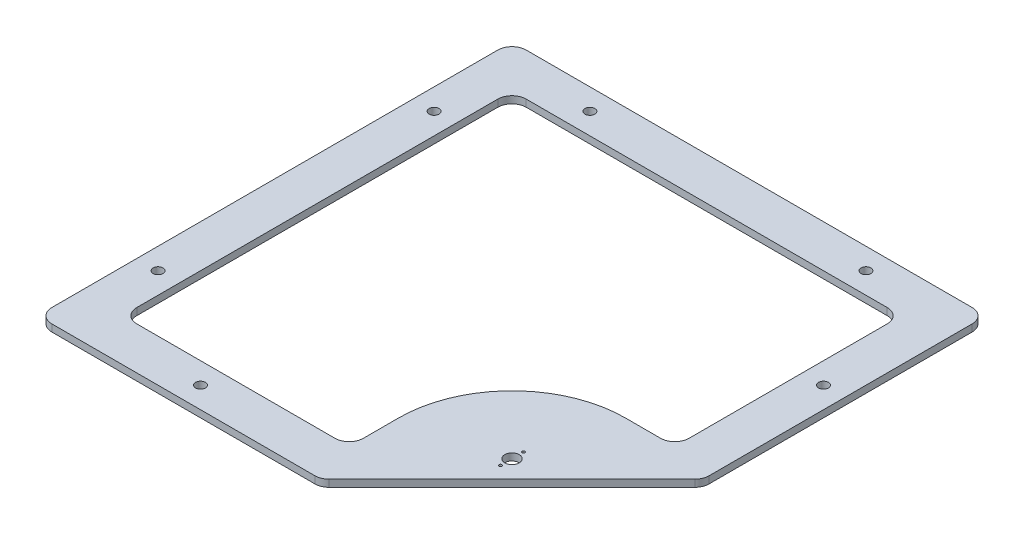
ISO-10303-21;
HEADER;
FILE_DESCRIPTION(('STEP AP214'),'2;1');
FILE_NAME('part.step','',(''),(''),'','','');
FILE_SCHEMA(('AUTOMOTIVE_DESIGN { 1 0 10303 214 1 1 1 1 }'));
ENDSEC;
DATA;
#1=APPLICATION_CONTEXT('core data for automotive mechanical design processes');
#2=APPLICATION_PROTOCOL_DEFINITION('international standard','automotive_design',2000,#1);
#3=PRODUCT_CONTEXT('',#1,'mechanical');
#4=PRODUCT('Part','Part','',(#3));
#5=PRODUCT_RELATED_PRODUCT_CATEGORY('part','',(#4));
#6=PRODUCT_DEFINITION_FORMATION('','',#4);
#7=PRODUCT_DEFINITION_CONTEXT('part definition',#1,'design');
#8=PRODUCT_DEFINITION('design','',#6,#7);
#9=PRODUCT_DEFINITION_SHAPE('','',#8);
#10=(LENGTH_UNIT() NAMED_UNIT(*) SI_UNIT(.MILLI.,.METRE.));
#11=(NAMED_UNIT(*) PLANE_ANGLE_UNIT() SI_UNIT($,.RADIAN.));
#12=(NAMED_UNIT(*) SI_UNIT($,.STERADIAN.) SOLID_ANGLE_UNIT());
#13=UNCERTAINTY_MEASURE_WITH_UNIT(LENGTH_MEASURE(1.E-05),#10,'distance_accuracy_value','');
#14=(GEOMETRIC_REPRESENTATION_CONTEXT(3) GLOBAL_UNCERTAINTY_ASSIGNED_CONTEXT((#13)) GLOBAL_UNIT_ASSIGNED_CONTEXT((#10,
#11,#12)) REPRESENTATION_CONTEXT('',''));
#15=CARTESIAN_POINT('',(0.,0.,0.));
#16=DIRECTION('',(0.,0.,1.));
#17=DIRECTION('',(1.,0.,0.));
#18=AXIS2_PLACEMENT_3D('',#15,#16,#17);
#19=CARTESIAN_POINT('',(212.725,3.175,212.725));
#20=DIRECTION('',(-1.,0.,0.));
#21=DIRECTION('',(0.,0.,1.));
#22=AXIS2_PLACEMENT_3D('',#19,#20,#21);
#23=PLANE('',#22);
#24=DIRECTION('',(0.,0.,-1.));
#25=VECTOR('',#24,1.);
#26=CARTESIAN_POINT('',(212.725,3.175,212.725));
#27=LINE('',#26,#25);
#28=CARTESIAN_POINT('',(212.725,3.175,36.0144877578617));
#29=VERTEX_POINT('',#28);
#30=CARTESIAN_POINT('',(212.725,3.175,-200.025));
#31=VERTEX_POINT('',#30);
#32=EDGE_CURVE('E217',#29,#31,#27,.T.);
#33=ORIENTED_EDGE('',*,*,#32,.F.);
#34=DIRECTION('',(0.,1.,0.));
#35=VECTOR('',#34,1.);
#36=CARTESIAN_POINT('',(212.725,3.175,36.0144877578617));
#37=LINE('',#36,#35);
#38=CARTESIAN_POINT('',(212.725,-3.175,36.0144877578617));
#39=VERTEX_POINT('',#38);
#40=EDGE_CURVE('E187',#29,#39,#37,.F.);
#41=ORIENTED_EDGE('',*,*,#40,.T.);
#42=DIRECTION('',(0.,0.,-1.));
#43=VECTOR('',#42,1.);
#44=CARTESIAN_POINT('',(212.725,-3.175,212.725));
#45=LINE('',#44,#43);
#46=CARTESIAN_POINT('',(212.725,-3.175,-200.025));
#47=VERTEX_POINT('',#46);
#48=EDGE_CURVE('E210',#39,#47,#45,.T.);
#49=ORIENTED_EDGE('',*,*,#48,.T.);
#50=DIRECTION('',(0.,-1.,0.));
#51=VECTOR('',#50,1.);
#52=CARTESIAN_POINT('',(212.725,3.175,-200.025));
#53=LINE('',#52,#51);
#54=EDGE_CURVE('E192',#47,#31,#53,.F.);
#55=ORIENTED_EDGE('',*,*,#54,.T.);
#56=EDGE_LOOP('',(#33,#41,#49,#55));
#57=FACE_BOUND('',#56,.T.);
#58=ADVANCED_FACE('F33',(#57),#23,.F.);
#59=CARTESIAN_POINT('',(-212.725,3.175,-212.725));
#60=DIRECTION('',(0.,0.,1.));
#61=DIRECTION('',(1.,0.,0.));
#62=AXIS2_PLACEMENT_3D('',#59,#60,#61);
#63=PLANE('',#62);
#64=DIRECTION('',(-1.,0.,0.));
#65=VECTOR('',#64,1.);
#66=CARTESIAN_POINT('',(-212.725,-3.175,-212.725));
#67=LINE('',#66,#65);
#68=CARTESIAN_POINT('',(200.025,-3.175,-212.725));
#69=VERTEX_POINT('',#68);
#70=CARTESIAN_POINT('',(-200.025,-3.175,-212.725));
#71=VERTEX_POINT('',#70);
#72=EDGE_CURVE('E230',#69,#71,#67,.T.);
#73=ORIENTED_EDGE('',*,*,#72,.T.);
#74=DIRECTION('',(0.,-1.,0.));
#75=VECTOR('',#74,1.);
#76=CARTESIAN_POINT('',(-200.025,3.175,-212.725));
#77=LINE('',#76,#75);
#78=CARTESIAN_POINT('',(-200.025,3.175,-212.725));
#79=VERTEX_POINT('',#78);
#80=EDGE_CURVE('E281',#71,#79,#77,.F.);
#81=ORIENTED_EDGE('',*,*,#80,.T.);
#82=DIRECTION('',(-1.,0.,0.));
#83=VECTOR('',#82,1.);
#84=CARTESIAN_POINT('',(-212.725,3.175,-212.725));
#85=LINE('',#84,#83);
#86=CARTESIAN_POINT('',(200.025,3.175,-212.725));
#87=VERTEX_POINT('',#86);
#88=EDGE_CURVE('E219',#87,#79,#85,.T.);
#89=ORIENTED_EDGE('',*,*,#88,.F.);
#90=DIRECTION('',(0.,-1.,0.));
#91=VECTOR('',#90,1.);
#92=CARTESIAN_POINT('',(200.025,3.175,-212.725));
#93=LINE('',#92,#91);
#94=EDGE_CURVE('E278',#87,#69,#93,.T.);
#95=ORIENTED_EDGE('',*,*,#94,.T.);
#96=EDGE_LOOP('',(#73,#81,#89,#95));
#97=FACE_BOUND('',#96,.T.);
#98=ADVANCED_FACE('F412',(#97),#63,.F.);
#99=CARTESIAN_POINT('',(-212.725,3.175,212.725));
#100=DIRECTION('',(1.,0.,0.));
#101=DIRECTION('',(0.,0.,-1.));
#102=AXIS2_PLACEMENT_3D('',#99,#100,#101);
#103=PLANE('',#102);
#104=DIRECTION('',(0.,0.,1.));
#105=VECTOR('',#104,1.);
#106=CARTESIAN_POINT('',(-212.725,3.175,212.725));
#107=LINE('',#106,#105);
#108=CARTESIAN_POINT('',(-212.725,3.175,-200.025));
#109=VERTEX_POINT('',#108);
#110=CARTESIAN_POINT('',(-212.725,3.175,200.025));
#111=VERTEX_POINT('',#110);
#112=EDGE_CURVE('E223',#109,#111,#107,.T.);
#113=ORIENTED_EDGE('',*,*,#112,.F.);
#114=DIRECTION('',(0.,-1.,0.));
#115=VECTOR('',#114,1.);
#116=CARTESIAN_POINT('',(-212.725,3.175,-200.025));
#117=LINE('',#116,#115);
#118=CARTESIAN_POINT('',(-212.725,-3.175,-200.025));
#119=VERTEX_POINT('',#118);
#120=EDGE_CURVE('E275',#109,#119,#117,.T.);
#121=ORIENTED_EDGE('',*,*,#120,.T.);
#122=DIRECTION('',(0.,0.,1.));
#123=VECTOR('',#122,1.);
#124=CARTESIAN_POINT('',(-212.725,-3.175,212.725));
#125=LINE('',#124,#123);
#126=CARTESIAN_POINT('',(-212.725,-3.175,200.025));
#127=VERTEX_POINT('',#126);
#128=EDGE_CURVE('E233',#119,#127,#125,.T.);
#129=ORIENTED_EDGE('',*,*,#128,.T.);
#130=DIRECTION('',(0.,-1.,0.));
#131=VECTOR('',#130,1.);
#132=CARTESIAN_POINT('',(-212.725,3.175,200.025));
#133=LINE('',#132,#131);
#134=EDGE_CURVE('E273',#127,#111,#133,.F.);
#135=ORIENTED_EDGE('',*,*,#134,.T.);
#136=EDGE_LOOP('',(#113,#121,#129,#135));
#137=FACE_BOUND('',#136,.T.);
#138=ADVANCED_FACE('F407',(#137),#103,.F.);
#139=CARTESIAN_POINT('',(-212.725,3.175,212.725));
#140=DIRECTION('',(0.,0.,-1.));
#141=DIRECTION('',(-1.,0.,0.));
#142=AXIS2_PLACEMENT_3D('',#139,#140,#141);
#143=PLANE('',#142);
#144=DIRECTION('',(1.,0.,0.));
#145=VECTOR('',#144,1.);
#146=CARTESIAN_POINT('',(-212.725,-3.175,212.725));
#147=LINE('',#146,#145);
#148=CARTESIAN_POINT('',(-200.025,-3.175,212.725));
#149=VERTEX_POINT('',#148);
#150=CARTESIAN_POINT('',(36.0144877578617,-3.175,212.725));
#151=VERTEX_POINT('',#150);
#152=EDGE_CURVE('E220',#149,#151,#147,.T.);
#153=ORIENTED_EDGE('',*,*,#152,.T.);
#154=DIRECTION('',(0.,1.,0.));
#155=VECTOR('',#154,1.);
#156=CARTESIAN_POINT('',(36.0144877578617,3.175,212.725));
#157=LINE('',#156,#155);
#158=CARTESIAN_POINT('',(36.0144877578617,3.175,212.725));
#159=VERTEX_POINT('',#158);
#160=EDGE_CURVE('E260',#151,#159,#157,.T.);
#161=ORIENTED_EDGE('',*,*,#160,.T.);
#162=DIRECTION('',(1.,0.,0.));
#163=VECTOR('',#162,1.);
#164=CARTESIAN_POINT('',(-212.725,3.175,212.725));
#165=LINE('',#164,#163);
#166=CARTESIAN_POINT('',(-200.025,3.175,212.725));
#167=VERTEX_POINT('',#166);
#168=EDGE_CURVE('E226',#167,#159,#165,.T.);
#169=ORIENTED_EDGE('',*,*,#168,.F.);
#170=DIRECTION('',(0.,-1.,0.));
#171=VECTOR('',#170,1.);
#172=CARTESIAN_POINT('',(-200.025,3.175,212.725));
#173=LINE('',#172,#171);
#174=EDGE_CURVE('E257',#167,#149,#173,.T.);
#175=ORIENTED_EDGE('',*,*,#174,.T.);
#176=EDGE_LOOP('',(#153,#161,#169,#175));
#177=FACE_BOUND('',#176,.T.);
#178=ADVANCED_FACE('F399',(#177),#143,.F.);
#179=CARTESIAN_POINT('',(0.,3.175,0.));
#180=DIRECTION('',(0.,-1.,0.));
#181=DIRECTION('',(0.,0.,-1.));
#182=AXIS2_PLACEMENT_3D('',#179,#180,#181);
#183=PLANE('',#182);
#184=DIRECTION('',(1.,0.,0.));
#185=VECTOR('',#184,1.);
#186=CARTESIAN_POINT('',(174.625,3.175,28.5749999999999));
#187=LINE('',#186,#185);
#188=CARTESIAN_POINT('',(130.175,3.175,28.5749999999999));
#189=VERTEX_POINT('',#188);
#190=CARTESIAN_POINT('',(161.925,3.175,28.5749999999999));
#191=VERTEX_POINT('',#190);
#192=EDGE_CURVE('E327',#189,#191,#187,.T.);
#193=ORIENTED_EDGE('',*,*,#192,.F.);
#194=CARTESIAN_POINT('',(130.175,3.175,130.175));
#195=DIRECTION('',(0.,-1.,0.));
#196=DIRECTION('',(0.,0.,-1.));
#197=AXIS2_PLACEMENT_3D('',#194,#195,#196);
#198=CIRCLE('',#197,101.6);
#199=CARTESIAN_POINT('',(28.5749999999999,3.175,130.175));
#200=VERTEX_POINT('',#199);
#201=EDGE_CURVE('E55',#189,#200,#198,.F.);
#202=ORIENTED_EDGE('',*,*,#201,.T.);
#203=DIRECTION('',(0.,0.,-1.));
#204=VECTOR('',#203,1.);
#205=CARTESIAN_POINT('',(28.5749999999999,3.175,28.5749999999999));
#206=LINE('',#205,#204);
#207=CARTESIAN_POINT('',(28.5749999999999,3.175,161.925));
#208=VERTEX_POINT('',#207);
#209=EDGE_CURVE('E335',#208,#200,#206,.T.);
#210=ORIENTED_EDGE('',*,*,#209,.F.);
#211=CARTESIAN_POINT('',(15.8749999999999,3.175,161.925));
#212=DIRECTION('',(0.,-1.,0.));
#213=DIRECTION('',(0.,0.,-1.));
#214=AXIS2_PLACEMENT_3D('',#211,#212,#213);
#215=CIRCLE('',#214,12.7);
#216=CARTESIAN_POINT('',(15.8749999999999,3.175,174.625));
#217=VERTEX_POINT('',#216);
#218=EDGE_CURVE('E312',#208,#217,#215,.T.);
#219=ORIENTED_EDGE('',*,*,#218,.T.);
#220=DIRECTION('',(1.,0.,0.));
#221=VECTOR('',#220,1.);
#222=CARTESIAN_POINT('',(28.5749999999999,3.175,174.625));
#223=LINE('',#222,#221);
#224=CARTESIAN_POINT('',(-161.925,3.175,174.625));
#225=VERTEX_POINT('',#224);
#226=EDGE_CURVE('E340',#225,#217,#223,.T.);
#227=ORIENTED_EDGE('',*,*,#226,.F.);
#228=CARTESIAN_POINT('',(-161.925,3.175,161.925));
#229=DIRECTION('',(0.,-1.,0.));
#230=DIRECTION('',(0.,0.,-1.));
#231=AXIS2_PLACEMENT_3D('',#228,#229,#230);
#232=CIRCLE('',#231,12.7);
#233=CARTESIAN_POINT('',(-174.625,3.175,161.925));
#234=VERTEX_POINT('',#233);
#235=EDGE_CURVE('E316',#225,#234,#232,.T.);
#236=ORIENTED_EDGE('',*,*,#235,.T.);
#237=DIRECTION('',(0.,0.,1.));
#238=VECTOR('',#237,1.);
#239=CARTESIAN_POINT('',(-174.625,3.175,174.625));
#240=LINE('',#239,#238);
#241=CARTESIAN_POINT('',(-174.625,3.175,-161.925));
#242=VERTEX_POINT('',#241);
#243=EDGE_CURVE('E788',#242,#234,#240,.T.);
#244=ORIENTED_EDGE('',*,*,#243,.F.);
#245=CARTESIAN_POINT('',(-161.925,3.175,-161.925));
#246=DIRECTION('',(0.,-1.,0.));
#247=DIRECTION('',(0.,0.,-1.));
#248=AXIS2_PLACEMENT_3D('',#245,#246,#247);
#249=CIRCLE('',#248,12.7);
#250=CARTESIAN_POINT('',(-161.925,3.175,-174.625));
#251=VERTEX_POINT('',#250);
#252=EDGE_CURVE('E299',#242,#251,#249,.T.);
#253=ORIENTED_EDGE('',*,*,#252,.T.);
#254=DIRECTION('',(-1.,0.,0.));
#255=VECTOR('',#254,1.);
#256=CARTESIAN_POINT('',(-174.625,3.175,-174.625));
#257=LINE('',#256,#255);
#258=CARTESIAN_POINT('',(161.925,3.175,-174.625));
#259=VERTEX_POINT('',#258);
#260=EDGE_CURVE('E785',#259,#251,#257,.T.);
#261=ORIENTED_EDGE('',*,*,#260,.F.);
#262=CARTESIAN_POINT('',(161.925,3.175,-161.925));
#263=DIRECTION('',(0.,-1.,0.));
#264=DIRECTION('',(0.,0.,-1.));
#265=AXIS2_PLACEMENT_3D('',#262,#263,#264);
#266=CIRCLE('',#265,12.7);
#267=CARTESIAN_POINT('',(174.625,3.175,-161.925));
#268=VERTEX_POINT('',#267);
#269=EDGE_CURVE('E303',#259,#268,#266,.T.);
#270=ORIENTED_EDGE('',*,*,#269,.T.);
#271=DIRECTION('',(0.,0.,-1.));
#272=VECTOR('',#271,1.);
#273=CARTESIAN_POINT('',(174.625,3.175,-174.625));
#274=LINE('',#273,#272);
#275=CARTESIAN_POINT('',(174.625,3.175,15.8749999999999));
#276=VERTEX_POINT('',#275);
#277=EDGE_CURVE('E334',#276,#268,#274,.T.);
#278=ORIENTED_EDGE('',*,*,#277,.F.);
#279=CARTESIAN_POINT('',(161.925,3.175,15.8749999999999));
#280=DIRECTION('',(0.,-1.,0.));
#281=DIRECTION('',(0.,0.,-1.));
#282=AXIS2_PLACEMENT_3D('',#279,#280,#281);
#283=CIRCLE('',#282,12.7);
#284=EDGE_CURVE('E307',#276,#191,#283,.T.);
#285=ORIENTED_EDGE('',*,*,#284,.T.);
#286=EDGE_LOOP('',(#193,#202,#210,#219,#227,#236,#244,#253,#261,#270,#278,#285));
#287=FACE_BOUND('',#286,.T.);
#288=CARTESIAN_POINT('',(-85.7250000000001,3.175,193.675));
#289=DIRECTION('',(0.,1.,0.));
#290=DIRECTION('',(0.,0.,1.));
#291=AXIS2_PLACEMENT_3D('',#288,#289,#290);
#292=CIRCLE('',#291,4.4196);
#293=CARTESIAN_POINT('',(-85.7250000000001,3.175,198.0946));
#294=VERTEX_POINT('',#293);
#295=EDGE_CURVE('E344',#294,#294,#292,.T.);
#296=ORIENTED_EDGE('',*,*,#295,.F.);
#297=EDGE_LOOP('',(#296));
#298=FACE_BOUND('',#297,.T.);
#299=CARTESIAN_POINT('',(-193.675,3.175,123.825));
#300=DIRECTION('',(0.,1.,0.));
#301=DIRECTION('',(0.,0.,1.));
#302=AXIS2_PLACEMENT_3D('',#299,#300,#301);
#303=CIRCLE('',#302,4.4196);
#304=CARTESIAN_POINT('',(-193.675,3.175,128.2446));
#305=VERTEX_POINT('',#304);
#306=EDGE_CURVE('E351',#305,#305,#303,.T.);
#307=ORIENTED_EDGE('',*,*,#306,.F.);
#308=EDGE_LOOP('',(#307));
#309=FACE_BOUND('',#308,.T.);
#310=CARTESIAN_POINT('',(-193.675,3.175,-123.825));
#311=DIRECTION('',(0.,1.,0.));
#312=DIRECTION('',(0.,0.,1.));
#313=AXIS2_PLACEMENT_3D('',#310,#311,#312);
#314=CIRCLE('',#313,4.4196);
#315=CARTESIAN_POINT('',(-193.675,3.175,-119.4054));
#316=VERTEX_POINT('',#315);
#317=EDGE_CURVE('E357',#316,#316,#314,.T.);
#318=ORIENTED_EDGE('',*,*,#317,.F.);
#319=EDGE_LOOP('',(#318));
#320=FACE_BOUND('',#319,.T.);
#321=CARTESIAN_POINT('',(-123.825,3.175,-193.675));
#322=DIRECTION('',(0.,1.,0.));
#323=DIRECTION('',(0.,0.,1.));
#324=AXIS2_PLACEMENT_3D('',#321,#322,#323);
#325=CIRCLE('',#324,4.4196);
#326=CARTESIAN_POINT('',(-123.825,3.175,-189.2554));
#327=VERTEX_POINT('',#326);
#328=EDGE_CURVE('E363',#327,#327,#325,.T.);
#329=ORIENTED_EDGE('',*,*,#328,.F.);
#330=EDGE_LOOP('',(#329));
#331=FACE_BOUND('',#330,.T.);
#332=CARTESIAN_POINT('',(123.825,3.175,-193.675));
#333=DIRECTION('',(0.,1.,0.));
#334=DIRECTION('',(0.,0.,1.));
#335=AXIS2_PLACEMENT_3D('',#332,#333,#334);
#336=CIRCLE('',#335,4.41960000000001);
#337=CARTESIAN_POINT('',(123.825,3.175,-189.2554));
#338=VERTEX_POINT('',#337);
#339=EDGE_CURVE('E369',#338,#338,#336,.T.);
#340=ORIENTED_EDGE('',*,*,#339,.F.);
#341=EDGE_LOOP('',(#340));
#342=FACE_BOUND('',#341,.T.);
#343=CARTESIAN_POINT('',(193.675,3.175,-85.725));
#344=DIRECTION('',(0.,1.,0.));
#345=DIRECTION('',(0.,0.,1.));
#346=AXIS2_PLACEMENT_3D('',#343,#344,#345);
#347=CIRCLE('',#346,4.4196);
#348=CARTESIAN_POINT('',(193.675,3.175,-81.3054));
#349=VERTEX_POINT('',#348);
#350=EDGE_CURVE('E375',#349,#349,#347,.T.);
#351=ORIENTED_EDGE('',*,*,#350,.F.);
#352=EDGE_LOOP('',(#351));
#353=FACE_BOUND('',#352,.T.);
#354=CARTESIAN_POINT('',(111.125,3.175,100.7999));
#355=DIRECTION('',(0.,1.,0.));
#356=DIRECTION('',(0.,0.,1.));
#357=AXIS2_PLACEMENT_3D('',#354,#355,#356);
#358=CIRCLE('',#357,1.26999999999999);
#359=CARTESIAN_POINT('',(111.125,3.175,102.0699));
#360=VERTEX_POINT('',#359);
#361=EDGE_CURVE('E385',#360,#360,#358,.T.);
#362=ORIENTED_EDGE('',*,*,#361,.F.);
#363=EDGE_LOOP('',(#362));
#364=FACE_BOUND('',#363,.T.);
#365=CARTESIAN_POINT('',(111.125,3.175,121.4501));
#366=DIRECTION('',(0.,1.,0.));
#367=DIRECTION('',(0.,0.,1.));
#368=AXIS2_PLACEMENT_3D('',#365,#366,#367);
#369=CIRCLE('',#368,1.26999999999999);
#370=CARTESIAN_POINT('',(111.125,3.175,122.7201));
#371=VERTEX_POINT('',#370);
#372=EDGE_CURVE('E381',#371,#371,#369,.T.);
#373=ORIENTED_EDGE('',*,*,#372,.F.);
#374=EDGE_LOOP('',(#373));
#375=FACE_BOUND('',#374,.T.);
#376=CARTESIAN_POINT('',(111.125,3.175,111.125));
#377=DIRECTION('',(0.,1.,0.));
#378=DIRECTION('',(0.,0.,1.));
#379=AXIS2_PLACEMENT_3D('',#376,#377,#378);
#380=CIRCLE('',#379,6.477);
#381=CARTESIAN_POINT('',(111.125,3.175,117.602));
#382=VERTEX_POINT('',#381);
#383=EDGE_CURVE('E213',#382,#382,#380,.T.);
#384=ORIENTED_EDGE('',*,*,#383,.F.);
#385=EDGE_LOOP('',(#384));
#386=FACE_BOUND('',#385,.T.);
#387=DIRECTION('',(-0.707106781186548,0.,0.707106781186548));
#388=VECTOR('',#387,1.);
#389=CARTESIAN_POINT('',(212.725,3.175,41.275));
#390=LINE('',#389,#388);
#391=CARTESIAN_POINT('',(209.005256121069,3.175,44.9947438789308));
#392=VERTEX_POINT('',#391);
#393=CARTESIAN_POINT('',(44.9947438789308,3.175,209.005256121069));
#394=VERTEX_POINT('',#393);
#395=EDGE_CURVE('E199',#392,#394,#390,.T.);
#396=ORIENTED_EDGE('',*,*,#395,.F.);
#397=CARTESIAN_POINT('',(200.025,3.175,36.0144877578617));
#398=DIRECTION('',(0.,-1.,0.));
#399=DIRECTION('',(0.,0.,-1.));
#400=AXIS2_PLACEMENT_3D('',#397,#398,#399);
#401=CIRCLE('',#400,12.7);
#402=EDGE_CURVE('E182',#392,#29,#401,.F.);
#403=ORIENTED_EDGE('',*,*,#402,.T.);
#404=ORIENTED_EDGE('',*,*,#32,.T.);
#405=CARTESIAN_POINT('',(200.025,3.175,-200.025));
#406=DIRECTION('',(0.,-1.,0.));
#407=DIRECTION('',(0.,0.,-1.));
#408=AXIS2_PLACEMENT_3D('',#405,#406,#407);
#409=CIRCLE('',#408,12.7);
#410=EDGE_CURVE('E240',#31,#87,#409,.F.);
#411=ORIENTED_EDGE('',*,*,#410,.T.);
#412=ORIENTED_EDGE('',*,*,#88,.T.);
#413=CARTESIAN_POINT('',(-200.025,3.175,-200.025));
#414=DIRECTION('',(0.,-1.,0.));
#415=DIRECTION('',(0.,0.,-1.));
#416=AXIS2_PLACEMENT_3D('',#413,#414,#415);
#417=CIRCLE('',#416,12.7);
#418=EDGE_CURVE('E242',#79,#109,#417,.F.);
#419=ORIENTED_EDGE('',*,*,#418,.T.);
#420=ORIENTED_EDGE('',*,*,#112,.T.);
#421=CARTESIAN_POINT('',(-200.025,3.175,200.025));
#422=DIRECTION('',(0.,-1.,0.));
#423=DIRECTION('',(0.,0.,-1.));
#424=AXIS2_PLACEMENT_3D('',#421,#422,#423);
#425=CIRCLE('',#424,12.7);
#426=EDGE_CURVE('E203',#111,#167,#425,.F.);
#427=ORIENTED_EDGE('',*,*,#426,.T.);
#428=ORIENTED_EDGE('',*,*,#168,.T.);
#429=CARTESIAN_POINT('',(36.0144877578617,3.175,200.025));
#430=DIRECTION('',(0.,-1.,0.));
#431=DIRECTION('',(0.,0.,-1.));
#432=AXIS2_PLACEMENT_3D('',#429,#430,#431);
#433=CIRCLE('',#432,12.7);
#434=EDGE_CURVE('E193',#159,#394,#433,.F.);
#435=ORIENTED_EDGE('',*,*,#434,.T.);
#436=EDGE_LOOP('',(#396,#403,#404,#411,#412,#419,#420,#427,#428,#435));
#437=FACE_BOUND('',#436,.T.);
#438=ADVANCED_FACE('F206',(#287,#298,#309,#320,#331,#342,#353,#364,#375,#386,#437),#183,.F.);
#439=CARTESIAN_POINT('',(0.,-3.175,0.));
#440=DIRECTION('',(0.,-1.,0.));
#441=DIRECTION('',(0.,0.,-1.));
#442=AXIS2_PLACEMENT_3D('',#439,#440,#441);
#443=PLANE('',#442);
#444=DIRECTION('',(0.,0.,-1.));
#445=VECTOR('',#444,1.);
#446=CARTESIAN_POINT('',(28.5749999999999,-3.175,28.5749999999999));
#447=LINE('',#446,#445);
#448=CARTESIAN_POINT('',(28.5749999999999,-3.175,161.925));
#449=VERTEX_POINT('',#448);
#450=CARTESIAN_POINT('',(28.5749999999999,-3.175,130.175));
#451=VERTEX_POINT('',#450);
#452=EDGE_CURVE('E773',#449,#451,#447,.T.);
#453=ORIENTED_EDGE('',*,*,#452,.T.);
#454=CARTESIAN_POINT('',(130.175,-3.175,130.175));
#455=DIRECTION('',(0.,-1.,0.));
#456=DIRECTION('',(0.,0.,-1.));
#457=AXIS2_PLACEMENT_3D('',#454,#455,#456);
#458=CIRCLE('',#457,101.6);
#459=CARTESIAN_POINT('',(130.175,-3.175,28.5749999999999));
#460=VERTEX_POINT('',#459);
#461=EDGE_CURVE('E11',#451,#460,#458,.T.);
#462=ORIENTED_EDGE('',*,*,#461,.T.);
#463=DIRECTION('',(1.,0.,0.));
#464=VECTOR('',#463,1.);
#465=CARTESIAN_POINT('',(174.625,-3.175,28.5749999999999));
#466=LINE('',#465,#464);
#467=CARTESIAN_POINT('',(161.925,-3.175,28.5749999999999));
#468=VERTEX_POINT('',#467);
#469=EDGE_CURVE('E328',#460,#468,#466,.T.);
#470=ORIENTED_EDGE('',*,*,#469,.T.);
#471=CARTESIAN_POINT('',(161.925,-3.175,15.8749999999999));
#472=DIRECTION('',(0.,-1.,0.));
#473=DIRECTION('',(0.,0.,-1.));
#474=AXIS2_PLACEMENT_3D('',#471,#472,#473);
#475=CIRCLE('',#474,12.7);
#476=CARTESIAN_POINT('',(174.625,-3.175,15.8749999999999));
#477=VERTEX_POINT('',#476);
#478=EDGE_CURVE('E310',#468,#477,#475,.F.);
#479=ORIENTED_EDGE('',*,*,#478,.T.);
#480=DIRECTION('',(0.,0.,-1.));
#481=VECTOR('',#480,1.);
#482=CARTESIAN_POINT('',(174.625,-3.175,-174.625));
#483=LINE('',#482,#481);
#484=CARTESIAN_POINT('',(174.625,-3.175,-161.925));
#485=VERTEX_POINT('',#484);
#486=EDGE_CURVE('E348',#477,#485,#483,.T.);
#487=ORIENTED_EDGE('',*,*,#486,.T.);
#488=CARTESIAN_POINT('',(161.925,-3.175,-161.925));
#489=DIRECTION('',(0.,-1.,0.));
#490=DIRECTION('',(0.,0.,-1.));
#491=AXIS2_PLACEMENT_3D('',#488,#489,#490);
#492=CIRCLE('',#491,12.7);
#493=CARTESIAN_POINT('',(161.925,-3.175,-174.625));
#494=VERTEX_POINT('',#493);
#495=EDGE_CURVE('E305',#485,#494,#492,.F.);
#496=ORIENTED_EDGE('',*,*,#495,.T.);
#497=DIRECTION('',(-1.,0.,0.));
#498=VECTOR('',#497,1.);
#499=CARTESIAN_POINT('',(-174.625,-3.175,-174.625));
#500=LINE('',#499,#498);
#501=CARTESIAN_POINT('',(-161.925,-3.175,-174.625));
#502=VERTEX_POINT('',#501);
#503=EDGE_CURVE('E338',#494,#502,#500,.T.);
#504=ORIENTED_EDGE('',*,*,#503,.T.);
#505=CARTESIAN_POINT('',(-161.925,-3.175,-161.925));
#506=DIRECTION('',(0.,-1.,0.));
#507=DIRECTION('',(0.,0.,-1.));
#508=AXIS2_PLACEMENT_3D('',#505,#506,#507);
#509=CIRCLE('',#508,12.7);
#510=CARTESIAN_POINT('',(-174.625,-3.175,-161.925));
#511=VERTEX_POINT('',#510);
#512=EDGE_CURVE('E301',#502,#511,#509,.F.);
#513=ORIENTED_EDGE('',*,*,#512,.T.);
#514=DIRECTION('',(0.,0.,1.));
#515=VECTOR('',#514,1.);
#516=CARTESIAN_POINT('',(-174.625,-3.175,174.625));
#517=LINE('',#516,#515);
#518=CARTESIAN_POINT('',(-174.625,-3.175,161.925));
#519=VERTEX_POINT('',#518);
#520=EDGE_CURVE('E779',#511,#519,#517,.T.);
#521=ORIENTED_EDGE('',*,*,#520,.T.);
#522=CARTESIAN_POINT('',(-161.925,-3.175,161.925));
#523=DIRECTION('',(0.,-1.,0.));
#524=DIRECTION('',(0.,0.,-1.));
#525=AXIS2_PLACEMENT_3D('',#522,#523,#524);
#526=CIRCLE('',#525,12.7);
#527=CARTESIAN_POINT('',(-161.925,-3.175,174.625));
#528=VERTEX_POINT('',#527);
#529=EDGE_CURVE('E318',#519,#528,#526,.F.);
#530=ORIENTED_EDGE('',*,*,#529,.T.);
#531=DIRECTION('',(1.,0.,0.));
#532=VECTOR('',#531,1.);
#533=CARTESIAN_POINT('',(28.5749999999999,-3.175,174.625));
#534=LINE('',#533,#532);
#535=CARTESIAN_POINT('',(15.8749999999999,-3.175,174.625));
#536=VERTEX_POINT('',#535);
#537=EDGE_CURVE('E776',#528,#536,#534,.T.);
#538=ORIENTED_EDGE('',*,*,#537,.T.);
#539=CARTESIAN_POINT('',(15.8749999999999,-3.175,161.925));
#540=DIRECTION('',(0.,-1.,0.));
#541=DIRECTION('',(0.,0.,-1.));
#542=AXIS2_PLACEMENT_3D('',#539,#540,#541);
#543=CIRCLE('',#542,12.7);
#544=EDGE_CURVE('E314',#536,#449,#543,.F.);
#545=ORIENTED_EDGE('',*,*,#544,.T.);
#546=EDGE_LOOP('',(#453,#462,#470,#479,#487,#496,#504,#513,#521,#530,#538,#545));
#547=FACE_BOUND('',#546,.T.);
#548=CARTESIAN_POINT('',(-85.7250000000001,-3.175,193.675));
#549=DIRECTION('',(0.,1.,0.));
#550=DIRECTION('',(0.,0.,1.));
#551=AXIS2_PLACEMENT_3D('',#548,#549,#550);
#552=CIRCLE('',#551,4.4196);
#553=CARTESIAN_POINT('',(-85.7250000000001,-3.175,198.0946));
#554=VERTEX_POINT('',#553);
#555=EDGE_CURVE('E347',#554,#554,#552,.T.);
#556=ORIENTED_EDGE('',*,*,#555,.T.);
#557=EDGE_LOOP('',(#556));
#558=FACE_BOUND('',#557,.T.);
#559=CARTESIAN_POINT('',(-193.675,-3.175,123.825));
#560=DIRECTION('',(0.,1.,0.));
#561=DIRECTION('',(0.,0.,1.));
#562=AXIS2_PLACEMENT_3D('',#559,#560,#561);
#563=CIRCLE('',#562,4.4196);
#564=CARTESIAN_POINT('',(-193.675,-3.175,128.2446));
#565=VERTEX_POINT('',#564);
#566=EDGE_CURVE('E354',#565,#565,#563,.T.);
#567=ORIENTED_EDGE('',*,*,#566,.T.);
#568=EDGE_LOOP('',(#567));
#569=FACE_BOUND('',#568,.T.);
#570=CARTESIAN_POINT('',(-193.675,-3.175,-123.825));
#571=DIRECTION('',(0.,1.,0.));
#572=DIRECTION('',(0.,0.,1.));
#573=AXIS2_PLACEMENT_3D('',#570,#571,#572);
#574=CIRCLE('',#573,4.4196);
#575=CARTESIAN_POINT('',(-193.675,-3.175,-119.4054));
#576=VERTEX_POINT('',#575);
#577=EDGE_CURVE('E360',#576,#576,#574,.T.);
#578=ORIENTED_EDGE('',*,*,#577,.T.);
#579=EDGE_LOOP('',(#578));
#580=FACE_BOUND('',#579,.T.);
#581=CARTESIAN_POINT('',(-123.825,-3.175,-193.675));
#582=DIRECTION('',(0.,1.,0.));
#583=DIRECTION('',(0.,0.,1.));
#584=AXIS2_PLACEMENT_3D('',#581,#582,#583);
#585=CIRCLE('',#584,4.4196);
#586=CARTESIAN_POINT('',(-123.825,-3.175,-189.2554));
#587=VERTEX_POINT('',#586);
#588=EDGE_CURVE('E366',#587,#587,#585,.T.);
#589=ORIENTED_EDGE('',*,*,#588,.T.);
#590=EDGE_LOOP('',(#589));
#591=FACE_BOUND('',#590,.T.);
#592=CARTESIAN_POINT('',(123.825,-3.175,-193.675));
#593=DIRECTION('',(0.,1.,0.));
#594=DIRECTION('',(0.,0.,1.));
#595=AXIS2_PLACEMENT_3D('',#592,#593,#594);
#596=CIRCLE('',#595,4.41960000000001);
#597=CARTESIAN_POINT('',(123.825,-3.175,-189.2554));
#598=VERTEX_POINT('',#597);
#599=EDGE_CURVE('E372',#598,#598,#596,.T.);
#600=ORIENTED_EDGE('',*,*,#599,.T.);
#601=EDGE_LOOP('',(#600));
#602=FACE_BOUND('',#601,.T.);
#603=CARTESIAN_POINT('',(193.675,-3.175,-85.725));
#604=DIRECTION('',(0.,1.,0.));
#605=DIRECTION('',(0.,0.,1.));
#606=AXIS2_PLACEMENT_3D('',#603,#604,#605);
#607=CIRCLE('',#606,4.4196);
#608=CARTESIAN_POINT('',(193.675,-3.175,-81.3054));
#609=VERTEX_POINT('',#608);
#610=EDGE_CURVE('E378',#609,#609,#607,.T.);
#611=ORIENTED_EDGE('',*,*,#610,.T.);
#612=EDGE_LOOP('',(#611));
#613=FACE_BOUND('',#612,.T.);
#614=CARTESIAN_POINT('',(111.125,-3.175,100.7999));
#615=DIRECTION('',(0.,1.,0.));
#616=DIRECTION('',(0.,0.,1.));
#617=AXIS2_PLACEMENT_3D('',#614,#615,#616);
#618=CIRCLE('',#617,1.26999999999999);
#619=CARTESIAN_POINT('',(111.125,-3.175,102.0699));
#620=VERTEX_POINT('',#619);
#621=EDGE_CURVE('E382',#620,#620,#618,.T.);
#622=ORIENTED_EDGE('',*,*,#621,.T.);
#623=EDGE_LOOP('',(#622));
#624=FACE_BOUND('',#623,.T.);
#625=CARTESIAN_POINT('',(111.125,-3.175,121.4501));
#626=DIRECTION('',(0.,1.,0.));
#627=DIRECTION('',(0.,0.,1.));
#628=AXIS2_PLACEMENT_3D('',#625,#626,#627);
#629=CIRCLE('',#628,1.26999999999999);
#630=CARTESIAN_POINT('',(111.125,-3.175,122.7201));
#631=VERTEX_POINT('',#630);
#632=EDGE_CURVE('E388',#631,#631,#629,.T.);
#633=ORIENTED_EDGE('',*,*,#632,.T.);
#634=EDGE_LOOP('',(#633));
#635=FACE_BOUND('',#634,.T.);
#636=CARTESIAN_POINT('',(111.125,-3.175,111.125));
#637=DIRECTION('',(0.,1.,0.));
#638=DIRECTION('',(0.,0.,1.));
#639=AXIS2_PLACEMENT_3D('',#636,#637,#638);
#640=CIRCLE('',#639,6.477);
#641=CARTESIAN_POINT('',(111.125,-3.175,117.602));
#642=VERTEX_POINT('',#641);
#643=EDGE_CURVE('E208',#642,#642,#640,.T.);
#644=ORIENTED_EDGE('',*,*,#643,.T.);
#645=EDGE_LOOP('',(#644));
#646=FACE_BOUND('',#645,.T.);
#647=ORIENTED_EDGE('',*,*,#48,.F.);
#648=CARTESIAN_POINT('',(200.025,-3.175,36.0144877578617));
#649=DIRECTION('',(0.,-1.,0.));
#650=DIRECTION('',(0.,0.,-1.));
#651=AXIS2_PLACEMENT_3D('',#648,#649,#650);
#652=CIRCLE('',#651,12.7);
#653=CARTESIAN_POINT('',(209.005256121069,-3.175,44.9947438789308));
#654=VERTEX_POINT('',#653);
#655=EDGE_CURVE('E255',#39,#654,#652,.T.);
#656=ORIENTED_EDGE('',*,*,#655,.T.);
#657=DIRECTION('',(-0.707106781186548,0.,0.707106781186548));
#658=VECTOR('',#657,1.);
#659=CARTESIAN_POINT('',(212.725,-3.175,41.275));
#660=LINE('',#659,#658);
#661=CARTESIAN_POINT('',(44.9947438789308,-3.175,209.005256121069));
#662=VERTEX_POINT('',#661);
#663=EDGE_CURVE('E202',#654,#662,#660,.T.);
#664=ORIENTED_EDGE('',*,*,#663,.T.);
#665=CARTESIAN_POINT('',(36.0144877578617,-3.175,200.025));
#666=DIRECTION('',(0.,-1.,0.));
#667=DIRECTION('',(0.,0.,-1.));
#668=AXIS2_PLACEMENT_3D('',#665,#666,#667);
#669=CIRCLE('',#668,12.7);
#670=EDGE_CURVE('E253',#662,#151,#669,.T.);
#671=ORIENTED_EDGE('',*,*,#670,.T.);
#672=ORIENTED_EDGE('',*,*,#152,.F.);
#673=CARTESIAN_POINT('',(-200.025,-3.175,200.025));
#674=DIRECTION('',(0.,-1.,0.));
#675=DIRECTION('',(0.,0.,-1.));
#676=AXIS2_PLACEMENT_3D('',#673,#674,#675);
#677=CIRCLE('',#676,12.7);
#678=EDGE_CURVE('E247',#149,#127,#677,.T.);
#679=ORIENTED_EDGE('',*,*,#678,.T.);
#680=ORIENTED_EDGE('',*,*,#128,.F.);
#681=CARTESIAN_POINT('',(-200.025,-3.175,-200.025));
#682=DIRECTION('',(0.,-1.,0.));
#683=DIRECTION('',(0.,0.,-1.));
#684=AXIS2_PLACEMENT_3D('',#681,#682,#683);
#685=CIRCLE('',#684,12.7);
#686=EDGE_CURVE('E251',#119,#71,#685,.T.);
#687=ORIENTED_EDGE('',*,*,#686,.T.);
#688=ORIENTED_EDGE('',*,*,#72,.F.);
#689=CARTESIAN_POINT('',(200.025,-3.175,-200.025));
#690=DIRECTION('',(0.,-1.,0.));
#691=DIRECTION('',(0.,0.,-1.));
#692=AXIS2_PLACEMENT_3D('',#689,#690,#691);
#693=CIRCLE('',#692,12.7);
#694=EDGE_CURVE('E249',#69,#47,#693,.T.);
#695=ORIENTED_EDGE('',*,*,#694,.T.);
#696=EDGE_LOOP('',(#647,#656,#664,#671,#672,#679,#680,#687,#688,#695));
#697=FACE_BOUND('',#696,.T.);
#698=ADVANCED_FACE('F398',(#547,#558,#569,#580,#591,#602,#613,#624,#635,#646,#697),#443,.T.);
#699=CARTESIAN_POINT('',(212.725,-3.175,41.275));
#700=DIRECTION('',(-0.707106781186548,0.,-0.707106781186548));
#701=DIRECTION('',(-0.707106781186548,0.,0.707106781186548));
#702=AXIS2_PLACEMENT_3D('',#699,#700,#701);
#703=PLANE('',#702);
#704=ORIENTED_EDGE('',*,*,#663,.F.);
#705=DIRECTION('',(0.,1.,0.));
#706=VECTOR('',#705,1.);
#707=CARTESIAN_POINT('',(209.005256121069,-3.175,44.9947438789308));
#708=LINE('',#707,#706);
#709=EDGE_CURVE('E186',#654,#392,#708,.T.);
#710=ORIENTED_EDGE('',*,*,#709,.T.);
#711=ORIENTED_EDGE('',*,*,#395,.T.);
#712=DIRECTION('',(0.,1.,0.));
#713=VECTOR('',#712,1.);
#714=CARTESIAN_POINT('',(44.9947438789308,-3.175,209.005256121069));
#715=LINE('',#714,#713);
#716=EDGE_CURVE('E204',#394,#662,#715,.F.);
#717=ORIENTED_EDGE('',*,*,#716,.T.);
#718=EDGE_LOOP('',(#704,#710,#711,#717));
#719=FACE_BOUND('',#718,.T.);
#720=ADVANCED_FACE('F198',(#719),#703,.F.);
#721=CARTESIAN_POINT('',(111.125,-3.175,111.125));
#722=DIRECTION('',(0.,1.,0.));
#723=DIRECTION('',(0.,0.,1.));
#724=AXIS2_PLACEMENT_3D('',#721,#722,#723);
#725=CYLINDRICAL_SURFACE('',#724,6.477);
#726=ORIENTED_EDGE('',*,*,#643,.F.);
#727=EDGE_LOOP('',(#726));
#728=FACE_BOUND('',#727,.T.);
#729=ORIENTED_EDGE('',*,*,#383,.T.);
#730=EDGE_LOOP('',(#729));
#731=FACE_BOUND('',#730,.T.);
#732=ADVANCED_FACE('F395',(#728,#731),#725,.F.);
#733=CARTESIAN_POINT('',(111.125,-3.175,121.4501));
#734=DIRECTION('',(0.,1.,0.));
#735=DIRECTION('',(0.,0.,1.));
#736=AXIS2_PLACEMENT_3D('',#733,#734,#735);
#737=CYLINDRICAL_SURFACE('',#736,1.26999999999999);
#738=ORIENTED_EDGE('',*,*,#632,.F.);
#739=EDGE_LOOP('',(#738));
#740=FACE_BOUND('',#739,.T.);
#741=ORIENTED_EDGE('',*,*,#372,.T.);
#742=EDGE_LOOP('',(#741));
#743=FACE_BOUND('',#742,.T.);
#744=ADVANCED_FACE('F663',(#740,#743),#737,.F.);
#745=CARTESIAN_POINT('',(111.125,-3.175,100.7999));
#746=DIRECTION('',(0.,1.,0.));
#747=DIRECTION('',(0.,0.,1.));
#748=AXIS2_PLACEMENT_3D('',#745,#746,#747);
#749=CYLINDRICAL_SURFACE('',#748,1.26999999999999);
#750=ORIENTED_EDGE('',*,*,#621,.F.);
#751=EDGE_LOOP('',(#750));
#752=FACE_BOUND('',#751,.T.);
#753=ORIENTED_EDGE('',*,*,#361,.T.);
#754=EDGE_LOOP('',(#753));
#755=FACE_BOUND('',#754,.T.);
#756=ADVANCED_FACE('F659',(#752,#755),#749,.F.);
#757=CARTESIAN_POINT('',(193.675,3.175,-85.725));
#758=DIRECTION('',(0.,1.,0.));
#759=DIRECTION('',(0.,0.,1.));
#760=AXIS2_PLACEMENT_3D('',#757,#758,#759);
#761=CYLINDRICAL_SURFACE('',#760,4.4196);
#762=ORIENTED_EDGE('',*,*,#610,.F.);
#763=EDGE_LOOP('',(#762));
#764=FACE_BOUND('',#763,.T.);
#765=ORIENTED_EDGE('',*,*,#350,.T.);
#766=EDGE_LOOP('',(#765));
#767=FACE_BOUND('',#766,.T.);
#768=ADVANCED_FACE('F655',(#764,#767),#761,.F.);
#769=CARTESIAN_POINT('',(123.825,3.175,-193.675));
#770=DIRECTION('',(0.,1.,0.));
#771=DIRECTION('',(0.,0.,1.));
#772=AXIS2_PLACEMENT_3D('',#769,#770,#771);
#773=CYLINDRICAL_SURFACE('',#772,4.41960000000001);
#774=ORIENTED_EDGE('',*,*,#599,.F.);
#775=EDGE_LOOP('',(#774));
#776=FACE_BOUND('',#775,.T.);
#777=ORIENTED_EDGE('',*,*,#339,.T.);
#778=EDGE_LOOP('',(#777));
#779=FACE_BOUND('',#778,.T.);
#780=ADVANCED_FACE('F651',(#776,#779),#773,.F.);
#781=CARTESIAN_POINT('',(-123.825,3.175,-193.675));
#782=DIRECTION('',(0.,1.,0.));
#783=DIRECTION('',(0.,0.,1.));
#784=AXIS2_PLACEMENT_3D('',#781,#782,#783);
#785=CYLINDRICAL_SURFACE('',#784,4.4196);
#786=ORIENTED_EDGE('',*,*,#588,.F.);
#787=EDGE_LOOP('',(#786));
#788=FACE_BOUND('',#787,.T.);
#789=ORIENTED_EDGE('',*,*,#328,.T.);
#790=EDGE_LOOP('',(#789));
#791=FACE_BOUND('',#790,.T.);
#792=ADVANCED_FACE('F647',(#788,#791),#785,.F.);
#793=CARTESIAN_POINT('',(-193.675,3.175,-123.825));
#794=DIRECTION('',(0.,1.,0.));
#795=DIRECTION('',(0.,0.,1.));
#796=AXIS2_PLACEMENT_3D('',#793,#794,#795);
#797=CYLINDRICAL_SURFACE('',#796,4.4196);
#798=ORIENTED_EDGE('',*,*,#577,.F.);
#799=EDGE_LOOP('',(#798));
#800=FACE_BOUND('',#799,.T.);
#801=ORIENTED_EDGE('',*,*,#317,.T.);
#802=EDGE_LOOP('',(#801));
#803=FACE_BOUND('',#802,.T.);
#804=ADVANCED_FACE('F643',(#800,#803),#797,.F.);
#805=CARTESIAN_POINT('',(-193.675,3.175,123.825));
#806=DIRECTION('',(0.,1.,0.));
#807=DIRECTION('',(0.,0.,1.));
#808=AXIS2_PLACEMENT_3D('',#805,#806,#807);
#809=CYLINDRICAL_SURFACE('',#808,4.4196);
#810=ORIENTED_EDGE('',*,*,#566,.F.);
#811=EDGE_LOOP('',(#810));
#812=FACE_BOUND('',#811,.T.);
#813=ORIENTED_EDGE('',*,*,#306,.T.);
#814=EDGE_LOOP('',(#813));
#815=FACE_BOUND('',#814,.T.);
#816=ADVANCED_FACE('F639',(#812,#815),#809,.F.);
#817=CARTESIAN_POINT('',(-85.7250000000001,3.175,193.675));
#818=DIRECTION('',(0.,1.,0.));
#819=DIRECTION('',(0.,0.,1.));
#820=AXIS2_PLACEMENT_3D('',#817,#818,#819);
#821=CYLINDRICAL_SURFACE('',#820,4.4196);
#822=ORIENTED_EDGE('',*,*,#555,.F.);
#823=EDGE_LOOP('',(#822));
#824=FACE_BOUND('',#823,.T.);
#825=ORIENTED_EDGE('',*,*,#295,.T.);
#826=EDGE_LOOP('',(#825));
#827=FACE_BOUND('',#826,.T.);
#828=ADVANCED_FACE('F513',(#824,#827),#821,.F.);
#829=CARTESIAN_POINT('',(-174.625,-3.175,-174.625));
#830=DIRECTION('',(0.,0.,-1.));
#831=DIRECTION('',(-1.,0.,0.));
#832=AXIS2_PLACEMENT_3D('',#829,#830,#831);
#833=PLANE('',#832);
#834=ORIENTED_EDGE('',*,*,#260,.T.);
#835=DIRECTION('',(0.,1.,0.));
#836=VECTOR('',#835,1.);
#837=CARTESIAN_POINT('',(-161.925,-3.175,-174.625));
#838=LINE('',#837,#836);
#839=EDGE_CURVE('E271',#251,#502,#838,.F.);
#840=ORIENTED_EDGE('',*,*,#839,.T.);
#841=ORIENTED_EDGE('',*,*,#503,.F.);
#842=DIRECTION('',(0.,1.,0.));
#843=VECTOR('',#842,1.);
#844=CARTESIAN_POINT('',(161.925,3.175,-174.625));
#845=LINE('',#844,#843);
#846=EDGE_CURVE('E268',#494,#259,#845,.T.);
#847=ORIENTED_EDGE('',*,*,#846,.T.);
#848=EDGE_LOOP('',(#834,#840,#841,#847));
#849=FACE_BOUND('',#848,.T.);
#850=ADVANCED_FACE('F507',(#849),#833,.F.);
#851=CARTESIAN_POINT('',(174.625,-3.175,-174.625));
#852=DIRECTION('',(1.,0.,0.));
#853=DIRECTION('',(0.,0.,-1.));
#854=AXIS2_PLACEMENT_3D('',#851,#852,#853);
#855=PLANE('',#854);
#856=ORIENTED_EDGE('',*,*,#277,.T.);
#857=DIRECTION('',(0.,1.,0.));
#858=VECTOR('',#857,1.);
#859=CARTESIAN_POINT('',(174.625,-3.175,-161.925));
#860=LINE('',#859,#858);
#861=EDGE_CURVE('E286',#268,#485,#860,.F.);
#862=ORIENTED_EDGE('',*,*,#861,.T.);
#863=ORIENTED_EDGE('',*,*,#486,.F.);
#864=DIRECTION('',(0.,1.,0.));
#865=VECTOR('',#864,1.);
#866=CARTESIAN_POINT('',(174.625,3.175,15.8749999999999));
#867=LINE('',#866,#865);
#868=EDGE_CURVE('E283',#477,#276,#867,.T.);
#869=ORIENTED_EDGE('',*,*,#868,.T.);
#870=EDGE_LOOP('',(#856,#862,#863,#869));
#871=FACE_BOUND('',#870,.T.);
#872=ADVANCED_FACE('F512',(#871),#855,.F.);
#873=CARTESIAN_POINT('',(174.625,-3.175,28.5749999999999));
#874=DIRECTION('',(0.,0.,1.));
#875=DIRECTION('',(1.,0.,0.));
#876=AXIS2_PLACEMENT_3D('',#873,#874,#875);
#877=PLANE('',#876);
#878=ORIENTED_EDGE('',*,*,#469,.F.);
#879=DIRECTION('',(0.,1.,0.));
#880=VECTOR('',#879,1.);
#881=CARTESIAN_POINT('',(130.175,-3.175,28.5749999999999));
#882=LINE('',#881,#880);
#883=EDGE_CURVE('E320',#460,#189,#882,.T.);
#884=ORIENTED_EDGE('',*,*,#883,.T.);
#885=ORIENTED_EDGE('',*,*,#192,.T.);
#886=DIRECTION('',(0.,1.,0.));
#887=VECTOR('',#886,1.);
#888=CARTESIAN_POINT('',(161.925,-3.175,28.5749999999999));
#889=LINE('',#888,#887);
#890=EDGE_CURVE('E288',#191,#468,#889,.F.);
#891=ORIENTED_EDGE('',*,*,#890,.T.);
#892=EDGE_LOOP('',(#878,#884,#885,#891));
#893=FACE_BOUND('',#892,.T.);
#894=ADVANCED_FACE('F326',(#893),#877,.F.);
#895=CARTESIAN_POINT('',(28.5749999999999,-3.175,28.5749999999999));
#896=DIRECTION('',(1.,0.,0.));
#897=DIRECTION('',(0.,0.,-1.));
#898=AXIS2_PLACEMENT_3D('',#895,#896,#897);
#899=PLANE('',#898);
#900=ORIENTED_EDGE('',*,*,#209,.T.);
#901=DIRECTION('',(0.,1.,0.));
#902=VECTOR('',#901,1.);
#903=CARTESIAN_POINT('',(28.5749999999999,-3.175,130.175));
#904=LINE('',#903,#902);
#905=EDGE_CURVE('E41',#200,#451,#904,.F.);
#906=ORIENTED_EDGE('',*,*,#905,.T.);
#907=ORIENTED_EDGE('',*,*,#452,.F.);
#908=DIRECTION('',(0.,1.,0.));
#909=VECTOR('',#908,1.);
#910=CARTESIAN_POINT('',(28.5749999999999,3.175,161.925));
#911=LINE('',#910,#909);
#912=EDGE_CURVE('E291',#449,#208,#911,.T.);
#913=ORIENTED_EDGE('',*,*,#912,.T.);
#914=EDGE_LOOP('',(#900,#906,#907,#913));
#915=FACE_BOUND('',#914,.T.);
#916=ADVANCED_FACE('F537',(#915),#899,.F.);
#917=CARTESIAN_POINT('',(28.5749999999999,-3.175,174.625));
#918=DIRECTION('',(0.,0.,1.));
#919=DIRECTION('',(1.,0.,0.));
#920=AXIS2_PLACEMENT_3D('',#917,#918,#919);
#921=PLANE('',#920);
#922=ORIENTED_EDGE('',*,*,#226,.T.);
#923=DIRECTION('',(0.,1.,0.));
#924=VECTOR('',#923,1.);
#925=CARTESIAN_POINT('',(15.8749999999999,-3.175,174.625));
#926=LINE('',#925,#924);
#927=EDGE_CURVE('E297',#217,#536,#926,.F.);
#928=ORIENTED_EDGE('',*,*,#927,.T.);
#929=ORIENTED_EDGE('',*,*,#537,.F.);
#930=DIRECTION('',(0.,1.,0.));
#931=VECTOR('',#930,1.);
#932=CARTESIAN_POINT('',(-161.925,3.175,174.625));
#933=LINE('',#932,#931);
#934=EDGE_CURVE('E294',#528,#225,#933,.T.);
#935=ORIENTED_EDGE('',*,*,#934,.T.);
#936=EDGE_LOOP('',(#922,#928,#929,#935));
#937=FACE_BOUND('',#936,.T.);
#938=ADVANCED_FACE('F532',(#937),#921,.F.);
#939=CARTESIAN_POINT('',(-174.625,-3.175,174.625));
#940=DIRECTION('',(-1.,0.,0.));
#941=DIRECTION('',(0.,0.,1.));
#942=AXIS2_PLACEMENT_3D('',#939,#940,#941);
#943=PLANE('',#942);
#944=ORIENTED_EDGE('',*,*,#520,.F.);
#945=DIRECTION('',(0.,1.,0.));
#946=VECTOR('',#945,1.);
#947=CARTESIAN_POINT('',(-174.625,3.175,-161.925));
#948=LINE('',#947,#946);
#949=EDGE_CURVE('E265',#511,#242,#948,.T.);
#950=ORIENTED_EDGE('',*,*,#949,.T.);
#951=ORIENTED_EDGE('',*,*,#243,.T.);
#952=DIRECTION('',(0.,1.,0.));
#953=VECTOR('',#952,1.);
#954=CARTESIAN_POINT('',(-174.625,-3.175,161.925));
#955=LINE('',#954,#953);
#956=EDGE_CURVE('E263',#234,#519,#955,.F.);
#957=ORIENTED_EDGE('',*,*,#956,.T.);
#958=EDGE_LOOP('',(#944,#950,#951,#957));
#959=FACE_BOUND('',#958,.T.);
#960=ADVANCED_FACE('F425',(#959),#943,.F.);
#961=CARTESIAN_POINT('',(200.025,-3.175,36.0144877578617));
#962=DIRECTION('',(0.,1.,0.));
#963=DIRECTION('',(0.,0.,1.));
#964=AXIS2_PLACEMENT_3D('',#961,#962,#963);
#965=CYLINDRICAL_SURFACE('',#964,12.7);
#966=ORIENTED_EDGE('',*,*,#655,.F.);
#967=ORIENTED_EDGE('',*,*,#40,.F.);
#968=ORIENTED_EDGE('',*,*,#402,.F.);
#969=ORIENTED_EDGE('',*,*,#709,.F.);
#970=EDGE_LOOP('',(#966,#967,#968,#969));
#971=FACE_BOUND('',#970,.T.);
#972=ADVANCED_FACE('F185',(#971),#965,.T.);
#973=CARTESIAN_POINT('',(36.0144877578617,3.175,200.025));
#974=DIRECTION('',(0.,1.,0.));
#975=DIRECTION('',(0.,0.,1.));
#976=AXIS2_PLACEMENT_3D('',#973,#974,#975);
#977=CYLINDRICAL_SURFACE('',#976,12.7);
#978=ORIENTED_EDGE('',*,*,#670,.F.);
#979=ORIENTED_EDGE('',*,*,#716,.F.);
#980=ORIENTED_EDGE('',*,*,#434,.F.);
#981=ORIENTED_EDGE('',*,*,#160,.F.);
#982=EDGE_LOOP('',(#978,#979,#980,#981));
#983=FACE_BOUND('',#982,.T.);
#984=ADVANCED_FACE('F424',(#983),#977,.T.);
#985=CARTESIAN_POINT('',(-161.925,-3.175,-161.925));
#986=DIRECTION('',(0.,-1.,0.));
#987=DIRECTION('',(0.,0.,-1.));
#988=AXIS2_PLACEMENT_3D('',#985,#986,#987);
#989=CYLINDRICAL_SURFACE('',#988,12.7);
#990=ORIENTED_EDGE('',*,*,#512,.F.);
#991=ORIENTED_EDGE('',*,*,#839,.F.);
#992=ORIENTED_EDGE('',*,*,#252,.F.);
#993=ORIENTED_EDGE('',*,*,#949,.F.);
#994=EDGE_LOOP('',(#990,#991,#992,#993));
#995=FACE_BOUND('',#994,.T.);
#996=ADVANCED_FACE('F428',(#995),#989,.F.);
#997=CARTESIAN_POINT('',(-200.025,3.175,-200.025));
#998=DIRECTION('',(0.,-1.,0.));
#999=DIRECTION('',(0.,0.,-1.));
#1000=AXIS2_PLACEMENT_3D('',#997,#998,#999);
#1001=CYLINDRICAL_SURFACE('',#1000,12.7);
#1002=ORIENTED_EDGE('',*,*,#418,.F.);
#1003=ORIENTED_EDGE('',*,*,#80,.F.);
#1004=ORIENTED_EDGE('',*,*,#686,.F.);
#1005=ORIENTED_EDGE('',*,*,#120,.F.);
#1006=EDGE_LOOP('',(#1002,#1003,#1004,#1005));
#1007=FACE_BOUND('',#1006,.T.);
#1008=ADVANCED_FACE('F432',(#1007),#1001,.T.);
#1009=CARTESIAN_POINT('',(161.925,-3.175,-161.925));
#1010=DIRECTION('',(0.,-1.,0.));
#1011=DIRECTION('',(0.,0.,-1.));
#1012=AXIS2_PLACEMENT_3D('',#1009,#1010,#1011);
#1013=CYLINDRICAL_SURFACE('',#1012,12.7);
#1014=ORIENTED_EDGE('',*,*,#495,.F.);
#1015=ORIENTED_EDGE('',*,*,#861,.F.);
#1016=ORIENTED_EDGE('',*,*,#269,.F.);
#1017=ORIENTED_EDGE('',*,*,#846,.F.);
#1018=EDGE_LOOP('',(#1014,#1015,#1016,#1017));
#1019=FACE_BOUND('',#1018,.T.);
#1020=ADVANCED_FACE('F436',(#1019),#1013,.F.);
#1021=CARTESIAN_POINT('',(200.025,3.175,-200.025));
#1022=DIRECTION('',(0.,-1.,0.));
#1023=DIRECTION('',(0.,0.,-1.));
#1024=AXIS2_PLACEMENT_3D('',#1021,#1022,#1023);
#1025=CYLINDRICAL_SURFACE('',#1024,12.7);
#1026=ORIENTED_EDGE('',*,*,#410,.F.);
#1027=ORIENTED_EDGE('',*,*,#54,.F.);
#1028=ORIENTED_EDGE('',*,*,#694,.F.);
#1029=ORIENTED_EDGE('',*,*,#94,.F.);
#1030=EDGE_LOOP('',(#1026,#1027,#1028,#1029));
#1031=FACE_BOUND('',#1030,.T.);
#1032=ADVANCED_FACE('F440',(#1031),#1025,.T.);
#1033=CARTESIAN_POINT('',(161.925,-3.175,15.8749999999999));
#1034=DIRECTION('',(0.,-1.,0.));
#1035=DIRECTION('',(0.,0.,-1.));
#1036=AXIS2_PLACEMENT_3D('',#1033,#1034,#1035);
#1037=CYLINDRICAL_SURFACE('',#1036,12.7);
#1038=ORIENTED_EDGE('',*,*,#478,.F.);
#1039=ORIENTED_EDGE('',*,*,#890,.F.);
#1040=ORIENTED_EDGE('',*,*,#284,.F.);
#1041=ORIENTED_EDGE('',*,*,#868,.F.);
#1042=EDGE_LOOP('',(#1038,#1039,#1040,#1041));
#1043=FACE_BOUND('',#1042,.T.);
#1044=ADVANCED_FACE('F444',(#1043),#1037,.F.);
#1045=CARTESIAN_POINT('',(15.8749999999999,-3.175,161.925));
#1046=DIRECTION('',(0.,-1.,0.));
#1047=DIRECTION('',(0.,0.,-1.));
#1048=AXIS2_PLACEMENT_3D('',#1045,#1046,#1047);
#1049=CYLINDRICAL_SURFACE('',#1048,12.7);
#1050=ORIENTED_EDGE('',*,*,#544,.F.);
#1051=ORIENTED_EDGE('',*,*,#927,.F.);
#1052=ORIENTED_EDGE('',*,*,#218,.F.);
#1053=ORIENTED_EDGE('',*,*,#912,.F.);
#1054=EDGE_LOOP('',(#1050,#1051,#1052,#1053));
#1055=FACE_BOUND('',#1054,.T.);
#1056=ADVANCED_FACE('F448',(#1055),#1049,.F.);
#1057=CARTESIAN_POINT('',(-161.925,-3.175,161.925));
#1058=DIRECTION('',(0.,-1.,0.));
#1059=DIRECTION('',(0.,0.,-1.));
#1060=AXIS2_PLACEMENT_3D('',#1057,#1058,#1059);
#1061=CYLINDRICAL_SURFACE('',#1060,12.7);
#1062=ORIENTED_EDGE('',*,*,#529,.F.);
#1063=ORIENTED_EDGE('',*,*,#956,.F.);
#1064=ORIENTED_EDGE('',*,*,#235,.F.);
#1065=ORIENTED_EDGE('',*,*,#934,.F.);
#1066=EDGE_LOOP('',(#1062,#1063,#1064,#1065));
#1067=FACE_BOUND('',#1066,.T.);
#1068=ADVANCED_FACE('F452',(#1067),#1061,.F.);
#1069=CARTESIAN_POINT('',(-200.025,3.175,200.025));
#1070=DIRECTION('',(0.,-1.,0.));
#1071=DIRECTION('',(0.,0.,-1.));
#1072=AXIS2_PLACEMENT_3D('',#1069,#1070,#1071);
#1073=CYLINDRICAL_SURFACE('',#1072,12.7);
#1074=ORIENTED_EDGE('',*,*,#426,.F.);
#1075=ORIENTED_EDGE('',*,*,#134,.F.);
#1076=ORIENTED_EDGE('',*,*,#678,.F.);
#1077=ORIENTED_EDGE('',*,*,#174,.F.);
#1078=EDGE_LOOP('',(#1074,#1075,#1076,#1077));
#1079=FACE_BOUND('',#1078,.T.);
#1080=ADVANCED_FACE('F455',(#1079),#1073,.T.);
#1081=CARTESIAN_POINT('',(130.175,-3.175,130.175));
#1082=DIRECTION('',(0.,1.,0.));
#1083=DIRECTION('',(0.,0.,1.));
#1084=AXIS2_PLACEMENT_3D('',#1081,#1082,#1083);
#1085=CYLINDRICAL_SURFACE('',#1084,101.6);
#1086=ORIENTED_EDGE('',*,*,#461,.F.);
#1087=ORIENTED_EDGE('',*,*,#905,.F.);
#1088=ORIENTED_EDGE('',*,*,#201,.F.);
#1089=ORIENTED_EDGE('',*,*,#883,.F.);
#1090=EDGE_LOOP('',(#1086,#1087,#1088,#1089));
#1091=FACE_BOUND('',#1090,.T.);
#1092=ADVANCED_FACE('F35',(#1091),#1085,.T.);
#1093=CLOSED_SHELL('',(#58,#98,#138,#178,#438,#698,#720,#732,#744,#756,#768,#780,#792,#804,#816,
#828,#850,#872,#894,#916,#938,#960,#972,#984,#996,#1008,#1020,#1032,#1044,#1056,#1068,#1080,#1092));
#1094=MANIFOLD_SOLID_BREP('B2',#1093);
#1095=ADVANCED_BREP_SHAPE_REPRESENTATION('',(#18,#1094),#14);
#1096=SHAPE_DEFINITION_REPRESENTATION(#9,#1095);
ENDSEC;
END-ISO-10303-21;
